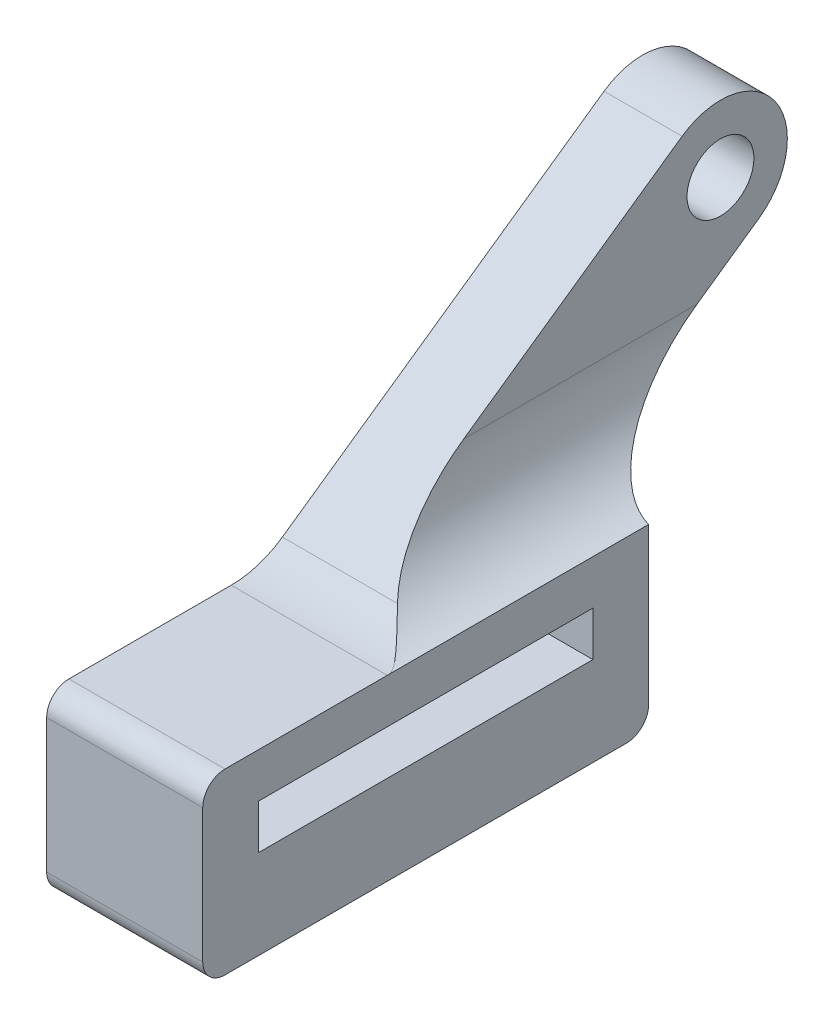
ISO-10303-21;
HEADER;
FILE_DESCRIPTION(('STEP AP214'),'2;1');
FILE_NAME('part.step','',(''),(''),'','','');
FILE_SCHEMA(('AUTOMOTIVE_DESIGN { 1 0 10303 214 1 1 1 1 }'));
ENDSEC;
DATA;
#1=APPLICATION_CONTEXT('core data for automotive mechanical design processes');
#2=APPLICATION_PROTOCOL_DEFINITION('international standard','automotive_design',2000,#1);
#3=PRODUCT_CONTEXT('',#1,'mechanical');
#4=PRODUCT('Part','Part','',(#3));
#5=PRODUCT_RELATED_PRODUCT_CATEGORY('part','',(#4));
#6=PRODUCT_DEFINITION_FORMATION('','',#4);
#7=PRODUCT_DEFINITION_CONTEXT('part definition',#1,'design');
#8=PRODUCT_DEFINITION('design','',#6,#7);
#9=PRODUCT_DEFINITION_SHAPE('','',#8);
#10=(LENGTH_UNIT() NAMED_UNIT(*) SI_UNIT(.MILLI.,.METRE.));
#11=(NAMED_UNIT(*) PLANE_ANGLE_UNIT() SI_UNIT($,.RADIAN.));
#12=(NAMED_UNIT(*) SI_UNIT($,.STERADIAN.) SOLID_ANGLE_UNIT());
#13=UNCERTAINTY_MEASURE_WITH_UNIT(LENGTH_MEASURE(1.E-05),#10,'distance_accuracy_value','');
#14=(GEOMETRIC_REPRESENTATION_CONTEXT(3) GLOBAL_UNCERTAINTY_ASSIGNED_CONTEXT((#13)) GLOBAL_UNIT_ASSIGNED_CONTEXT((#10,
#11,#12)) REPRESENTATION_CONTEXT('',''));
#15=CARTESIAN_POINT('',(0.,0.,0.));
#16=DIRECTION('',(0.,0.,1.));
#17=DIRECTION('',(1.,0.,0.));
#18=AXIS2_PLACEMENT_3D('',#15,#16,#17);
#19=CARTESIAN_POINT('',(3.5,4.,-10.));
#20=DIRECTION('',(0.,0.819152044288995,0.573576436351042));
#21=DIRECTION('',(0.,-0.573576436351042,0.819152044288995));
#22=AXIS2_PLACEMENT_3D('',#19,#20,#21);
#23=PLANE('',#22);
#24=DIRECTION('',(0.,-0.573576436351041,0.819152044288995));
#25=VECTOR('',#24,1.);
#26=CARTESIAN_POINT('',(0.,4.,-10.));
#27=LINE('',#26,#25);
#28=CARTESIAN_POINT('',(0.,9.91077295788324,-18.4414586181062));
#29=VERTEX_POINT('',#28);
#30=CARTESIAN_POINT('',(0.,7.96862696659689,-15.6677866918484));
#31=VERTEX_POINT('',#30);
#32=EDGE_CURVE('E156',#29,#31,#27,.T.);
#33=ORIENTED_EDGE('',*,*,#32,.T.);
#34=CARTESIAN_POINT('',(4.,7.96862696659689,-15.6677866918484));
#35=DIRECTION('',(0.,0.819152044288995,0.573576436351042));
#36=DIRECTION('',(0.,-0.573576436351042,0.819152044288995));
#37=AXIS2_PLACEMENT_3D('',#34,#35,#36);
#38=ELLIPSE('',#37,6.97378718248445,4.);
#39=CARTESIAN_POINT('',(3.5,4.,-10.));
#40=VERTEX_POINT('',#39);
#41=EDGE_CURVE('E195',#31,#40,#38,.T.);
#42=ORIENTED_EDGE('',*,*,#41,.T.);
#43=DIRECTION('',(-1.,0.,0.));
#44=VECTOR('',#43,1.);
#45=CARTESIAN_POINT('',(3.5,4.,-10.));
#46=LINE('',#45,#44);
#47=CARTESIAN_POINT('',(-3.5,4.,-10.));
#48=VERTEX_POINT('',#47);
#49=EDGE_CURVE('E174',#40,#48,#46,.T.);
#50=ORIENTED_EDGE('',*,*,#49,.T.);
#51=DIRECTION('',(0.,0.573576436351042,-0.819152044288995));
#52=VECTOR('',#51,1.);
#53=CARTESIAN_POINT('',(-3.5,4.,-10.));
#54=LINE('',#53,#52);
#55=CARTESIAN_POINT('',(-3.5,9.91077295788324,-18.4414586181062));
#56=VERTEX_POINT('',#55);
#57=EDGE_CURVE('E294',#48,#56,#54,.T.);
#58=ORIENTED_EDGE('',*,*,#57,.T.);
#59=DIRECTION('',(-1.,0.,0.));
#60=VECTOR('',#59,1.);
#61=CARTESIAN_POINT('',(3.5,9.91077295788324,-18.4414586181062));
#62=LINE('',#61,#60);
#63=EDGE_CURVE('E171',#29,#56,#62,.T.);
#64=ORIENTED_EDGE('',*,*,#63,.F.);
#65=EDGE_LOOP('',(#33,#42,#50,#58,#64));
#66=FACE_BOUND('',#65,.T.);
#67=ADVANCED_FACE('F33',(#66),#23,.F.);
#68=CARTESIAN_POINT('',(3.5,12.3682290907502,-16.7207293090531));
#69=DIRECTION('',(-1.,0.,0.));
#70=DIRECTION('',(0.,0.,1.));
#71=AXIS2_PLACEMENT_3D('',#68,#69,#70);
#72=CYLINDRICAL_SURFACE('',#71,3.);
#73=CARTESIAN_POINT('',(0.,12.3682290907502,-16.7207293090531));
#74=DIRECTION('',(1.,0.,0.));
#75=DIRECTION('',(0.,0.,-1.));
#76=AXIS2_PLACEMENT_3D('',#73,#74,#75);
#77=CIRCLE('',#76,3.);
#78=CARTESIAN_POINT('',(0.,14.8256852236172,-15.));
#79=VERTEX_POINT('',#78);
#80=EDGE_CURVE('E160',#79,#29,#77,.F.);
#81=ORIENTED_EDGE('',*,*,#80,.T.);
#82=ORIENTED_EDGE('',*,*,#63,.T.);
#83=CARTESIAN_POINT('',(-3.5,12.3682290907502,-16.7207293090531));
#84=DIRECTION('',(1.,0.,0.));
#85=DIRECTION('',(0.,0.,-1.));
#86=AXIS2_PLACEMENT_3D('',#83,#84,#85);
#87=CIRCLE('',#86,3.);
#88=CARTESIAN_POINT('',(-3.5,14.8256852236172,-15.));
#89=VERTEX_POINT('',#88);
#90=EDGE_CURVE('E169',#56,#89,#87,.T.);
#91=ORIENTED_EDGE('',*,*,#90,.T.);
#92=DIRECTION('',(-1.,0.,0.));
#93=VECTOR('',#92,1.);
#94=CARTESIAN_POINT('',(3.5,14.8256852236172,-15.));
#95=LINE('',#94,#93);
#96=EDGE_CURVE('E150',#79,#89,#95,.T.);
#97=ORIENTED_EDGE('',*,*,#96,.F.);
#98=EDGE_LOOP('',(#81,#82,#91,#97));
#99=FACE_BOUND('',#98,.T.);
#100=ADVANCED_FACE('F167',(#99),#72,.T.);
#101=CARTESIAN_POINT('',(3.5,4.,0.460680773726664));
#102=DIRECTION('',(0.,-0.819152044288995,-0.573576436351042));
#103=DIRECTION('',(0.,0.573576436351042,-0.819152044288995));
#104=AXIS2_PLACEMENT_3D('',#101,#102,#103);
#105=PLANE('',#104);
#106=DIRECTION('',(0.,-0.573576436351042,0.819152044288995));
#107=VECTOR('',#106,1.);
#108=CARTESIAN_POINT('',(-3.5,4.,0.460680773726664));
#109=LINE('',#108,#107);
#110=CARTESIAN_POINT('',(-3.5,4.72339182284402,-0.572429816161579));
#111=VERTEX_POINT('',#110);
#112=EDGE_CURVE('E299',#89,#111,#109,.T.);
#113=ORIENTED_EDGE('',*,*,#112,.T.);
#114=DIRECTION('',(-1.,0.,0.));
#115=VECTOR('',#114,1.);
#116=CARTESIAN_POINT('',(0.,4.72339182284402,-0.572429816161579));
#117=LINE('',#116,#115);
#118=CARTESIAN_POINT('',(1.66152852021775,4.72339182284402,-0.572429816161579));
#119=VERTEX_POINT('',#118);
#120=EDGE_CURVE('E192',#111,#119,#117,.F.);
#121=ORIENTED_EDGE('',*,*,#120,.T.);
#122=CARTESIAN_POINT('',(4.,7.96862696659689,-5.20710591812175));
#123=DIRECTION('',(0.,-0.819152044288995,-0.573576436351042));
#124=DIRECTION('',(0.,-0.573576436351042,0.819152044288995));
#125=AXIS2_PLACEMENT_3D('',#122,#123,#124);
#126=ELLIPSE('',#125,6.97378718248445,4.);
#127=CARTESIAN_POINT('',(0.,7.96862696659689,-5.20710591812175));
#128=VERTEX_POINT('',#127);
#129=EDGE_CURVE('E153',#119,#128,#126,.T.);
#130=ORIENTED_EDGE('',*,*,#129,.T.);
#131=DIRECTION('',(0.,0.573576436351042,-0.819152044288995));
#132=VECTOR('',#131,1.);
#133=CARTESIAN_POINT('',(0.,14.8256852236172,-15.));
#134=LINE('',#133,#132);
#135=EDGE_CURVE('E145',#128,#79,#134,.T.);
#136=ORIENTED_EDGE('',*,*,#135,.T.);
#137=ORIENTED_EDGE('',*,*,#96,.T.);
#138=EDGE_LOOP('',(#113,#121,#130,#136,#137));
#139=FACE_BOUND('',#138,.T.);
#140=ADVANCED_FACE('F148',(#139),#105,.F.);
#141=CARTESIAN_POINT('',(3.5,12.3682290907502,-16.7207293090531));
#142=DIRECTION('',(-1.,0.,0.));
#143=DIRECTION('',(0.,0.,1.));
#144=AXIS2_PLACEMENT_3D('',#141,#142,#143);
#145=CYLINDRICAL_SURFACE('',#144,1.5);
#146=CARTESIAN_POINT('',(-3.5,12.3682290907502,-16.7207293090531));
#147=DIRECTION('',(1.,0.,0.));
#148=DIRECTION('',(0.,0.,-1.));
#149=AXIS2_PLACEMENT_3D('',#146,#147,#148);
#150=CIRCLE('',#149,1.5);
#151=CARTESIAN_POINT('',(-3.5,12.3682290907502,-18.2207293090531));
#152=VERTEX_POINT('',#151);
#153=EDGE_CURVE('E188',#152,#152,#150,.T.);
#154=ORIENTED_EDGE('',*,*,#153,.F.);
#155=EDGE_LOOP('',(#154));
#156=FACE_BOUND('',#155,.T.);
#157=CARTESIAN_POINT('',(0.,12.3682290907502,-16.7207293090531));
#158=DIRECTION('',(1.,0.,0.));
#159=DIRECTION('',(0.,0.,-1.));
#160=AXIS2_PLACEMENT_3D('',#157,#158,#159);
#161=CIRCLE('',#160,1.5);
#162=CARTESIAN_POINT('',(0.,12.3682290907502,-18.2207293090531));
#163=VERTEX_POINT('',#162);
#164=EDGE_CURVE('E165',#163,#163,#161,.T.);
#165=ORIENTED_EDGE('',*,*,#164,.T.);
#166=EDGE_LOOP('',(#165));
#167=FACE_BOUND('',#166,.T.);
#168=ADVANCED_FACE('F325',(#156,#167),#145,.F.);
#169=CARTESIAN_POINT('',(3.5,12.3682290907502,-16.7207293090531));
#170=DIRECTION('',(1.,0.,0.));
#171=DIRECTION('',(0.,0.,-1.));
#172=AXIS2_PLACEMENT_3D('',#169,#170,#171);
#173=PLANE('',#172);
#174=DIRECTION('',(0.,0.,-1.));
#175=VECTOR('',#174,1.);
#176=CARTESIAN_POINT('',(3.5,-4.,-10.));
#177=LINE('',#176,#175);
#178=CARTESIAN_POINT('',(3.5,-4.,9.));
#179=VERTEX_POINT('',#178);
#180=CARTESIAN_POINT('',(3.5,-4.,-9.));
#181=VERTEX_POINT('',#180);
#182=EDGE_CURVE('E304',#179,#181,#177,.T.);
#183=ORIENTED_EDGE('',*,*,#182,.T.);
#184=CARTESIAN_POINT('',(3.5,-3.,-9.));
#185=DIRECTION('',(1.,0.,0.));
#186=DIRECTION('',(0.,0.,-1.));
#187=AXIS2_PLACEMENT_3D('',#184,#185,#186);
#188=CIRCLE('',#187,1.);
#189=CARTESIAN_POINT('',(3.5,-3.,-10.));
#190=VERTEX_POINT('',#189);
#191=EDGE_CURVE('E266',#181,#190,#188,.T.);
#192=ORIENTED_EDGE('',*,*,#191,.T.);
#193=DIRECTION('',(0.,1.,0.));
#194=VECTOR('',#193,1.);
#195=CARTESIAN_POINT('',(3.5,-4.,-10.));
#196=LINE('',#195,#194);
#197=EDGE_CURVE('E287',#190,#40,#196,.T.);
#198=ORIENTED_EDGE('',*,*,#197,.T.);
#199=DIRECTION('',(0.,0.,1.));
#200=VECTOR('',#199,1.);
#201=CARTESIAN_POINT('',(3.5,4.,0.460680773726664));
#202=LINE('',#201,#200);
#203=CARTESIAN_POINT('',(3.5,4.,1.72187592924259));
#204=VERTEX_POINT('',#203);
#205=EDGE_CURVE('E172',#40,#204,#202,.T.);
#206=ORIENTED_EDGE('',*,*,#205,.T.);
#207=CARTESIAN_POINT('',(3.5,4.,9.));
#208=VERTEX_POINT('',#207);
#209=EDGE_CURVE('E177',#204,#208,#202,.T.);
#210=ORIENTED_EDGE('',*,*,#209,.T.);
#211=CARTESIAN_POINT('',(3.5,3.,9.));
#212=DIRECTION('',(1.,0.,0.));
#213=DIRECTION('',(0.,0.,-1.));
#214=AXIS2_PLACEMENT_3D('',#211,#212,#213);
#215=CIRCLE('',#214,1.);
#216=CARTESIAN_POINT('',(3.5,3.,10.));
#217=VERTEX_POINT('',#216);
#218=EDGE_CURVE('E54',#208,#217,#215,.T.);
#219=ORIENTED_EDGE('',*,*,#218,.T.);
#220=DIRECTION('',(0.,-1.,0.));
#221=VECTOR('',#220,1.);
#222=CARTESIAN_POINT('',(3.5,-4.,10.));
#223=LINE('',#222,#221);
#224=CARTESIAN_POINT('',(3.5,-3.,10.));
#225=VERTEX_POINT('',#224);
#226=EDGE_CURVE('E301',#217,#225,#223,.T.);
#227=ORIENTED_EDGE('',*,*,#226,.T.);
#228=CARTESIAN_POINT('',(3.5,-3.,9.));
#229=DIRECTION('',(1.,0.,0.));
#230=DIRECTION('',(0.,0.,-1.));
#231=AXIS2_PLACEMENT_3D('',#228,#229,#230);
#232=CIRCLE('',#231,1.);
#233=EDGE_CURVE('E265',#225,#179,#232,.T.);
#234=ORIENTED_EDGE('',*,*,#233,.T.);
#235=EDGE_LOOP('',(#183,#192,#198,#206,#210,#219,#227,#234));
#236=FACE_BOUND('',#235,.T.);
#237=DIRECTION('',(0.,0.,-1.));
#238=VECTOR('',#237,1.);
#239=CARTESIAN_POINT('',(3.5,0.,-7.5));
#240=LINE('',#239,#238);
#241=CARTESIAN_POINT('',(3.5,0.,7.5));
#242=VERTEX_POINT('',#241);
#243=CARTESIAN_POINT('',(3.5,0.,-7.5));
#244=VERTEX_POINT('',#243);
#245=EDGE_CURVE('E387',#242,#244,#240,.T.);
#246=ORIENTED_EDGE('',*,*,#245,.F.);
#247=DIRECTION('',(0.,-1.,0.));
#248=VECTOR('',#247,1.);
#249=CARTESIAN_POINT('',(3.5,2.,7.5));
#250=LINE('',#249,#248);
#251=CARTESIAN_POINT('',(3.5,2.,7.5));
#252=VERTEX_POINT('',#251);
#253=EDGE_CURVE('E366',#252,#242,#250,.T.);
#254=ORIENTED_EDGE('',*,*,#253,.F.);
#255=DIRECTION('',(0.,0.,1.));
#256=VECTOR('',#255,1.);
#257=CARTESIAN_POINT('',(3.5,2.,-7.5));
#258=LINE('',#257,#256);
#259=CARTESIAN_POINT('',(3.5,2.,-7.5));
#260=VERTEX_POINT('',#259);
#261=EDGE_CURVE('E375',#260,#252,#258,.T.);
#262=ORIENTED_EDGE('',*,*,#261,.F.);
#263=DIRECTION('',(0.,1.,0.));
#264=VECTOR('',#263,1.);
#265=CARTESIAN_POINT('',(3.5,2.,-7.5));
#266=LINE('',#265,#264);
#267=EDGE_CURVE('E385',#244,#260,#266,.T.);
#268=ORIENTED_EDGE('',*,*,#267,.F.);
#269=EDGE_LOOP('',(#246,#254,#262,#268));
#270=FACE_BOUND('',#269,.T.);
#271=ADVANCED_FACE('F251',(#236,#270),#173,.T.);
#272=CARTESIAN_POINT('',(-3.5,12.3682290907502,-16.7207293090531));
#273=DIRECTION('',(1.,0.,0.));
#274=DIRECTION('',(0.,0.,-1.));
#275=AXIS2_PLACEMENT_3D('',#272,#273,#274);
#276=PLANE('',#275);
#277=DIRECTION('',(0.,1.,0.));
#278=VECTOR('',#277,1.);
#279=CARTESIAN_POINT('',(-3.5,-4.,-10.));
#280=LINE('',#279,#278);
#281=CARTESIAN_POINT('',(-3.5,-3.,-10.));
#282=VERTEX_POINT('',#281);
#283=EDGE_CURVE('E286',#282,#48,#280,.T.);
#284=ORIENTED_EDGE('',*,*,#283,.F.);
#285=CARTESIAN_POINT('',(-3.5,-3.,-9.));
#286=DIRECTION('',(1.,0.,0.));
#287=DIRECTION('',(0.,0.,-1.));
#288=AXIS2_PLACEMENT_3D('',#285,#286,#287);
#289=CIRCLE('',#288,1.);
#290=CARTESIAN_POINT('',(-3.5,-4.,-9.));
#291=VERTEX_POINT('',#290);
#292=EDGE_CURVE('E276',#282,#291,#289,.F.);
#293=ORIENTED_EDGE('',*,*,#292,.T.);
#294=DIRECTION('',(0.,0.,-1.));
#295=VECTOR('',#294,1.);
#296=CARTESIAN_POINT('',(-3.5,-4.,-10.));
#297=LINE('',#296,#295);
#298=CARTESIAN_POINT('',(-3.5,-4.,9.));
#299=VERTEX_POINT('',#298);
#300=EDGE_CURVE('E259',#299,#291,#297,.T.);
#301=ORIENTED_EDGE('',*,*,#300,.F.);
#302=CARTESIAN_POINT('',(-3.5,-3.,9.));
#303=DIRECTION('',(1.,0.,0.));
#304=DIRECTION('',(0.,0.,-1.));
#305=AXIS2_PLACEMENT_3D('',#302,#303,#304);
#306=CIRCLE('',#305,1.);
#307=CARTESIAN_POINT('',(-3.5,-3.,10.));
#308=VERTEX_POINT('',#307);
#309=EDGE_CURVE('E263',#299,#308,#306,.F.);
#310=ORIENTED_EDGE('',*,*,#309,.T.);
#311=DIRECTION('',(0.,-1.,0.));
#312=VECTOR('',#311,1.);
#313=CARTESIAN_POINT('',(-3.5,-4.,10.));
#314=LINE('',#313,#312);
#315=CARTESIAN_POINT('',(-3.5,3.,10.));
#316=VERTEX_POINT('',#315);
#317=EDGE_CURVE('E256',#316,#308,#314,.T.);
#318=ORIENTED_EDGE('',*,*,#317,.F.);
#319=CARTESIAN_POINT('',(-3.5,3.,9.));
#320=DIRECTION('',(1.,0.,0.));
#321=DIRECTION('',(0.,0.,-1.));
#322=AXIS2_PLACEMENT_3D('',#319,#320,#321);
#323=CIRCLE('',#322,1.);
#324=CARTESIAN_POINT('',(-3.5,4.,9.));
#325=VERTEX_POINT('',#324);
#326=EDGE_CURVE('E278',#316,#325,#323,.F.);
#327=ORIENTED_EDGE('',*,*,#326,.T.);
#328=DIRECTION('',(0.,0.,1.));
#329=VECTOR('',#328,1.);
#330=CARTESIAN_POINT('',(-3.5,4.,0.460680773726664));
#331=LINE('',#330,#329);
#332=CARTESIAN_POINT('',(-3.5,4.,1.72187592924259));
#333=VERTEX_POINT('',#332);
#334=EDGE_CURVE('E180',#333,#325,#331,.T.);
#335=ORIENTED_EDGE('',*,*,#334,.F.);
#336=CARTESIAN_POINT('',(-3.5,8.,1.72187592924259));
#337=DIRECTION('',(1.,0.,0.));
#338=DIRECTION('',(0.,0.,-1.));
#339=AXIS2_PLACEMENT_3D('',#336,#337,#338);
#340=CIRCLE('',#339,4.);
#341=EDGE_CURVE('E198',#333,#111,#340,.T.);
#342=ORIENTED_EDGE('',*,*,#341,.T.);
#343=ORIENTED_EDGE('',*,*,#112,.F.);
#344=ORIENTED_EDGE('',*,*,#90,.F.);
#345=ORIENTED_EDGE('',*,*,#57,.F.);
#346=EDGE_LOOP('',(#284,#293,#301,#310,#318,#327,#335,#342,#343,#344,#345));
#347=FACE_BOUND('',#346,.T.);
#348=DIRECTION('',(0.,-1.,0.));
#349=VECTOR('',#348,1.);
#350=CARTESIAN_POINT('',(-3.5,2.,7.5));
#351=LINE('',#350,#349);
#352=CARTESIAN_POINT('',(-3.5,2.,7.5));
#353=VERTEX_POINT('',#352);
#354=CARTESIAN_POINT('',(-3.5,0.,7.5));
#355=VERTEX_POINT('',#354);
#356=EDGE_CURVE('E361',#353,#355,#351,.T.);
#357=ORIENTED_EDGE('',*,*,#356,.T.);
#358=DIRECTION('',(0.,0.,-1.));
#359=VECTOR('',#358,1.);
#360=CARTESIAN_POINT('',(-3.5,0.,-7.5));
#361=LINE('',#360,#359);
#362=CARTESIAN_POINT('',(-3.5,0.,-7.5));
#363=VERTEX_POINT('',#362);
#364=EDGE_CURVE('E352',#355,#363,#361,.T.);
#365=ORIENTED_EDGE('',*,*,#364,.T.);
#366=DIRECTION('',(0.,1.,0.));
#367=VECTOR('',#366,1.);
#368=CARTESIAN_POINT('',(-3.5,2.,-7.5));
#369=LINE('',#368,#367);
#370=CARTESIAN_POINT('',(-3.5,2.,-7.5));
#371=VERTEX_POINT('',#370);
#372=EDGE_CURVE('E360',#363,#371,#369,.T.);
#373=ORIENTED_EDGE('',*,*,#372,.T.);
#374=DIRECTION('',(0.,0.,1.));
#375=VECTOR('',#374,1.);
#376=CARTESIAN_POINT('',(-3.5,2.,-7.5));
#377=LINE('',#376,#375);
#378=EDGE_CURVE('E370',#371,#353,#377,.T.);
#379=ORIENTED_EDGE('',*,*,#378,.T.);
#380=EDGE_LOOP('',(#357,#365,#373,#379));
#381=FACE_BOUND('',#380,.T.);
#382=ORIENTED_EDGE('',*,*,#153,.T.);
#383=EDGE_LOOP('',(#382));
#384=FACE_BOUND('',#383,.T.);
#385=ADVANCED_FACE('F247',(#347,#381,#384),#276,.F.);
#386=CARTESIAN_POINT('',(3.5,-4.,10.));
#387=DIRECTION('',(0.,0.,-1.));
#388=DIRECTION('',(0.,1.,0.));
#389=AXIS2_PLACEMENT_3D('',#386,#387,#388);
#390=PLANE('',#389);
#391=ORIENTED_EDGE('',*,*,#317,.T.);
#392=DIRECTION('',(-1.,0.,0.));
#393=VECTOR('',#392,1.);
#394=CARTESIAN_POINT('',(3.5,-3.,10.));
#395=LINE('',#394,#393);
#396=EDGE_CURVE('E41',#308,#225,#395,.F.);
#397=ORIENTED_EDGE('',*,*,#396,.T.);
#398=ORIENTED_EDGE('',*,*,#226,.F.);
#399=DIRECTION('',(-1.,0.,0.));
#400=VECTOR('',#399,1.);
#401=CARTESIAN_POINT('',(3.5,3.,10.));
#402=LINE('',#401,#400);
#403=EDGE_CURVE('E258',#217,#316,#402,.T.);
#404=ORIENTED_EDGE('',*,*,#403,.T.);
#405=EDGE_LOOP('',(#391,#397,#398,#404));
#406=FACE_BOUND('',#405,.T.);
#407=ADVANCED_FACE('F244',(#406),#390,.F.);
#408=CARTESIAN_POINT('',(3.5,-4.,-10.));
#409=DIRECTION('',(0.,1.,0.));
#410=DIRECTION('',(0.,0.,1.));
#411=AXIS2_PLACEMENT_3D('',#408,#409,#410);
#412=PLANE('',#411);
#413=ORIENTED_EDGE('',*,*,#300,.T.);
#414=DIRECTION('',(-1.,0.,0.));
#415=VECTOR('',#414,1.);
#416=CARTESIAN_POINT('',(3.5,-4.,-9.));
#417=LINE('',#416,#415);
#418=EDGE_CURVE('E272',#291,#181,#417,.F.);
#419=ORIENTED_EDGE('',*,*,#418,.T.);
#420=ORIENTED_EDGE('',*,*,#182,.F.);
#421=DIRECTION('',(-1.,0.,0.));
#422=VECTOR('',#421,1.);
#423=CARTESIAN_POINT('',(3.5,-4.,9.));
#424=LINE('',#423,#422);
#425=EDGE_CURVE('E274',#179,#299,#424,.T.);
#426=ORIENTED_EDGE('',*,*,#425,.T.);
#427=EDGE_LOOP('',(#413,#419,#420,#426));
#428=FACE_BOUND('',#427,.T.);
#429=ADVANCED_FACE('F241',(#428),#412,.F.);
#430=CARTESIAN_POINT('',(3.5,-4.,-10.));
#431=DIRECTION('',(0.,0.,1.));
#432=DIRECTION('',(1.,0.,0.));
#433=AXIS2_PLACEMENT_3D('',#430,#431,#432);
#434=PLANE('',#433);
#435=ORIENTED_EDGE('',*,*,#197,.F.);
#436=DIRECTION('',(-1.,0.,0.));
#437=VECTOR('',#436,1.);
#438=CARTESIAN_POINT('',(3.5,-3.,-10.));
#439=LINE('',#438,#437);
#440=EDGE_CURVE('E200',#190,#282,#439,.T.);
#441=ORIENTED_EDGE('',*,*,#440,.T.);
#442=ORIENTED_EDGE('',*,*,#283,.T.);
#443=ORIENTED_EDGE('',*,*,#49,.F.);
#444=EDGE_LOOP('',(#435,#441,#442,#443));
#445=FACE_BOUND('',#444,.T.);
#446=ADVANCED_FACE('F237',(#445),#434,.F.);
#447=CARTESIAN_POINT('',(3.5,4.,0.460680773726664));
#448=DIRECTION('',(0.,-1.,0.));
#449=DIRECTION('',(0.,0.,-1.));
#450=AXIS2_PLACEMENT_3D('',#447,#448,#449);
#451=PLANE('',#450);
#452=ORIENTED_EDGE('',*,*,#334,.T.);
#453=DIRECTION('',(-1.,0.,0.));
#454=VECTOR('',#453,1.);
#455=CARTESIAN_POINT('',(3.5,4.,9.));
#456=LINE('',#455,#454);
#457=EDGE_CURVE('E11',#325,#208,#456,.F.);
#458=ORIENTED_EDGE('',*,*,#457,.T.);
#459=ORIENTED_EDGE('',*,*,#209,.F.);
#460=DIRECTION('',(-1.,0.,0.));
#461=VECTOR('',#460,1.);
#462=CARTESIAN_POINT('',(-3.5,4.,1.72187592924259));
#463=LINE('',#462,#461);
#464=EDGE_CURVE('E185',#204,#333,#463,.T.);
#465=ORIENTED_EDGE('',*,*,#464,.T.);
#466=EDGE_LOOP('',(#452,#458,#459,#465));
#467=FACE_BOUND('',#466,.T.);
#468=ADVANCED_FACE('F240',(#467),#451,.F.);
#469=CARTESIAN_POINT('',(3.5,2.,7.5));
#470=DIRECTION('',(0.,0.,-1.));
#471=DIRECTION('',(-1.,0.,0.));
#472=AXIS2_PLACEMENT_3D('',#469,#470,#471);
#473=PLANE('',#472);
#474=ORIENTED_EDGE('',*,*,#356,.F.);
#475=DIRECTION('',(-1.,0.,0.));
#476=VECTOR('',#475,1.);
#477=CARTESIAN_POINT('',(3.5,2.,7.5));
#478=LINE('',#477,#476);
#479=EDGE_CURVE('E380',#252,#353,#478,.T.);
#480=ORIENTED_EDGE('',*,*,#479,.F.);
#481=ORIENTED_EDGE('',*,*,#253,.T.);
#482=DIRECTION('',(-1.,0.,0.));
#483=VECTOR('',#482,1.);
#484=CARTESIAN_POINT('',(3.5,0.,7.5));
#485=LINE('',#484,#483);
#486=EDGE_CURVE('E260',#242,#355,#485,.T.);
#487=ORIENTED_EDGE('',*,*,#486,.T.);
#488=EDGE_LOOP('',(#474,#480,#481,#487));
#489=FACE_BOUND('',#488,.T.);
#490=ADVANCED_FACE('F315',(#489),#473,.T.);
#491=CARTESIAN_POINT('',(3.5,0.,-7.5));
#492=DIRECTION('',(0.,1.,0.));
#493=DIRECTION('',(0.,0.,1.));
#494=AXIS2_PLACEMENT_3D('',#491,#492,#493);
#495=PLANE('',#494);
#496=ORIENTED_EDGE('',*,*,#364,.F.);
#497=ORIENTED_EDGE('',*,*,#486,.F.);
#498=ORIENTED_EDGE('',*,*,#245,.T.);
#499=DIRECTION('',(-1.,0.,0.));
#500=VECTOR('',#499,1.);
#501=CARTESIAN_POINT('',(3.5,0.,-7.5));
#502=LINE('',#501,#500);
#503=EDGE_CURVE('E356',#244,#363,#502,.T.);
#504=ORIENTED_EDGE('',*,*,#503,.T.);
#505=EDGE_LOOP('',(#496,#497,#498,#504));
#506=FACE_BOUND('',#505,.T.);
#507=ADVANCED_FACE('F320',(#506),#495,.T.);
#508=CARTESIAN_POINT('',(3.5,2.,-7.5));
#509=DIRECTION('',(0.,0.,1.));
#510=DIRECTION('',(1.,0.,0.));
#511=AXIS2_PLACEMENT_3D('',#508,#509,#510);
#512=PLANE('',#511);
#513=ORIENTED_EDGE('',*,*,#372,.F.);
#514=ORIENTED_EDGE('',*,*,#503,.F.);
#515=ORIENTED_EDGE('',*,*,#267,.T.);
#516=DIRECTION('',(-1.,0.,0.));
#517=VECTOR('',#516,1.);
#518=CARTESIAN_POINT('',(3.5,2.,-7.5));
#519=LINE('',#518,#517);
#520=EDGE_CURVE('E382',#260,#371,#519,.T.);
#521=ORIENTED_EDGE('',*,*,#520,.T.);
#522=EDGE_LOOP('',(#513,#514,#515,#521));
#523=FACE_BOUND('',#522,.T.);
#524=ADVANCED_FACE('F341',(#523),#512,.T.);
#525=CARTESIAN_POINT('',(3.5,2.,-7.5));
#526=DIRECTION('',(0.,-1.,0.));
#527=DIRECTION('',(0.,0.,-1.));
#528=AXIS2_PLACEMENT_3D('',#525,#526,#527);
#529=PLANE('',#528);
#530=ORIENTED_EDGE('',*,*,#378,.F.);
#531=ORIENTED_EDGE('',*,*,#520,.F.);
#532=ORIENTED_EDGE('',*,*,#261,.T.);
#533=ORIENTED_EDGE('',*,*,#479,.T.);
#534=EDGE_LOOP('',(#530,#531,#532,#533));
#535=FACE_BOUND('',#534,.T.);
#536=ADVANCED_FACE('F338',(#535),#529,.T.);
#537=CARTESIAN_POINT('',(0.,0.,0.));
#538=DIRECTION('',(1.,0.,0.));
#539=DIRECTION('',(0.,0.,-1.));
#540=AXIS2_PLACEMENT_3D('',#537,#538,#539);
#541=PLANE('',#540);
#542=ORIENTED_EDGE('',*,*,#164,.F.);
#543=EDGE_LOOP('',(#542));
#544=FACE_BOUND('',#543,.T.);
#545=ORIENTED_EDGE('',*,*,#135,.F.);
#546=DIRECTION('',(0.,0.,-1.));
#547=VECTOR('',#546,1.);
#548=CARTESIAN_POINT('',(0.,7.96862696659689,-10.));
#549=LINE('',#548,#547);
#550=EDGE_CURVE('E190',#128,#31,#549,.T.);
#551=ORIENTED_EDGE('',*,*,#550,.T.);
#552=ORIENTED_EDGE('',*,*,#32,.F.);
#553=ORIENTED_EDGE('',*,*,#80,.F.);
#554=EDGE_LOOP('',(#545,#551,#552,#553));
#555=FACE_BOUND('',#554,.T.);
#556=ADVANCED_FACE('F161',(#544,#555),#541,.T.);
#557=CARTESIAN_POINT('',(3.5,8.,1.72187592924259));
#558=DIRECTION('',(1.,0.,0.));
#559=DIRECTION('',(0.,0.,-1.));
#560=AXIS2_PLACEMENT_3D('',#557,#558,#559);
#561=CYLINDRICAL_SURFACE('',#560,4.);
#562=ORIENTED_EDGE('',*,*,#341,.F.);
#563=ORIENTED_EDGE('',*,*,#464,.F.);
#564=CARTESIAN_POINT('',(3.5,4.,1.72187592924259));
#565=CARTESIAN_POINT('',(3.50020177555954,3.99998714808562,1.68642276087569));
#566=CARTESIAN_POINT('',(3.49626425079582,4.00046935884848,1.6513281401927));
#567=CARTESIAN_POINT('',(3.48225804582612,4.00226618574442,1.58322637325178));
#568=CARTESIAN_POINT('',(3.47233840223862,4.00356059771724,1.55018936640703));
#569=CARTESIAN_POINT('',(3.43411575922563,4.00877761537605,1.44769490981525));
#570=CARTESIAN_POINT('',(3.39795700735747,4.01399706103,1.38146337621238));
#571=CARTESIAN_POINT('',(3.31759148434326,4.02704334076912,1.25299055817629));
#572=CARTESIAN_POINT('',(3.27322330523517,4.03492569397307,1.1908711046709));
#573=CARTESIAN_POINT('',(3.17712674279185,4.05385065559226,1.06436710902694));
#574=CARTESIAN_POINT('',(3.12509340161959,4.06510582096331,1.00024290499857));
#575=CARTESIAN_POINT('',(3.0191985448383,4.09035219787248,0.874062842913272));
#576=CARTESIAN_POINT('',(2.96533574632377,4.10434536359233,0.812008499414436));
#577=CARTESIAN_POINT('',(2.80236066123762,4.15046245748787,0.627732682590799));
#578=CARTESIAN_POINT('',(2.69202170740598,4.18669389269031,0.507593375261691));
#579=CARTESIAN_POINT('',(2.47250425769734,4.26991255613102,0.272098455495937));
#580=CARTESIAN_POINT('',(2.36332389875502,4.31680528670785,0.156710752071322));
#581=CARTESIAN_POINT('',(2.14675785391575,4.42180497737577,-0.0703714572500068));
#582=CARTESIAN_POINT('',(2.03937019705675,4.47989860053823,-0.182070172186057));
#583=CARTESIAN_POINT('',(1.88755031350272,4.57150553638626,-0.339300766679159));
#584=CARTESIAN_POINT('',(1.84192076910586,4.6002973581283,-0.386465600968597));
#585=CARTESIAN_POINT('',(1.75124910795808,4.66014234485765,-0.480040885978063));
#586=CARTESIAN_POINT('',(1.70620770854685,4.69119801338523,-0.526450429902623));
#587=CARTESIAN_POINT('',(1.66152852021848,4.72339182284406,-0.572429816162266));
#588=B_SPLINE_CURVE_WITH_KNOTS('',3,(#564,#565,#566,#567,#568,#569,#570,#571,#572,#573,#574,
#575,#576,#577,#578,#579,#580,#581,#582,#583,#584,#585,#586,#587),.UNSPECIFIED.,.F.,.F.,(4,2,2,
2,2,2,2,2,2,2,2,4),(0.,0.10557653680966,0.208625570178213,0.433769865405433,0.663932027915669,
0.913770148278608,1.16378723932746,1.66458145980646,2.16109886363649,2.65702867390104,
2.87198177384167,3.08717630153739),.UNSPECIFIED.);
#589=EDGE_CURVE('E157',#119,#204,#588,.F.);
#590=ORIENTED_EDGE('',*,*,#589,.F.);
#591=ORIENTED_EDGE('',*,*,#120,.F.);
#592=EDGE_LOOP('',(#562,#563,#590,#591));
#593=FACE_BOUND('',#592,.T.);
#594=ADVANCED_FACE('F209',(#593),#561,.F.);
#595=CARTESIAN_POINT('',(4.,7.96862696659689,0.460680773726665));
#596=DIRECTION('',(0.,0.,1.));
#597=DIRECTION('',(0.,-1.,0.));
#598=AXIS2_PLACEMENT_3D('',#595,#596,#597);
#599=CYLINDRICAL_SURFACE('',#598,4.);
#600=ORIENTED_EDGE('',*,*,#41,.F.);
#601=ORIENTED_EDGE('',*,*,#550,.F.);
#602=ORIENTED_EDGE('',*,*,#129,.F.);
#603=ORIENTED_EDGE('',*,*,#589,.T.);
#604=ORIENTED_EDGE('',*,*,#205,.F.);
#605=EDGE_LOOP('',(#600,#601,#602,#603,#604));
#606=FACE_BOUND('',#605,.T.);
#607=ADVANCED_FACE('F212',(#606),#599,.F.);
#608=CARTESIAN_POINT('',(3.5,-3.,-9.));
#609=DIRECTION('',(-1.,0.,0.));
#610=DIRECTION('',(0.,0.,1.));
#611=AXIS2_PLACEMENT_3D('',#608,#609,#610);
#612=CYLINDRICAL_SURFACE('',#611,1.);
#613=ORIENTED_EDGE('',*,*,#191,.F.);
#614=ORIENTED_EDGE('',*,*,#418,.F.);
#615=ORIENTED_EDGE('',*,*,#292,.F.);
#616=ORIENTED_EDGE('',*,*,#440,.F.);
#617=EDGE_LOOP('',(#613,#614,#615,#616));
#618=FACE_BOUND('',#617,.T.);
#619=ADVANCED_FACE('F216',(#618),#612,.T.);
#620=CARTESIAN_POINT('',(3.5,-3.,9.));
#621=DIRECTION('',(-1.,0.,0.));
#622=DIRECTION('',(0.,0.,1.));
#623=AXIS2_PLACEMENT_3D('',#620,#621,#622);
#624=CYLINDRICAL_SURFACE('',#623,1.);
#625=ORIENTED_EDGE('',*,*,#233,.F.);
#626=ORIENTED_EDGE('',*,*,#396,.F.);
#627=ORIENTED_EDGE('',*,*,#309,.F.);
#628=ORIENTED_EDGE('',*,*,#425,.F.);
#629=EDGE_LOOP('',(#625,#626,#627,#628));
#630=FACE_BOUND('',#629,.T.);
#631=ADVANCED_FACE('F219',(#630),#624,.T.);
#632=CARTESIAN_POINT('',(3.5,3.,9.));
#633=DIRECTION('',(-1.,0.,0.));
#634=DIRECTION('',(0.,0.,1.));
#635=AXIS2_PLACEMENT_3D('',#632,#633,#634);
#636=CYLINDRICAL_SURFACE('',#635,1.);
#637=ORIENTED_EDGE('',*,*,#218,.F.);
#638=ORIENTED_EDGE('',*,*,#457,.F.);
#639=ORIENTED_EDGE('',*,*,#326,.F.);
#640=ORIENTED_EDGE('',*,*,#403,.F.);
#641=EDGE_LOOP('',(#637,#638,#639,#640));
#642=FACE_BOUND('',#641,.T.);
#643=ADVANCED_FACE('F35',(#642),#636,.T.);
#644=CLOSED_SHELL('',(#67,#100,#140,#168,#271,#385,#407,#429,#446,#468,#490,#507,#524,#536,#556,
#594,#607,#619,#631,#643));
#645=MANIFOLD_SOLID_BREP('B2',#644);
#646=ADVANCED_BREP_SHAPE_REPRESENTATION('',(#18,#645),#14);
#647=SHAPE_DEFINITION_REPRESENTATION(#9,#646);
ENDSEC;
END-ISO-10303-21;
